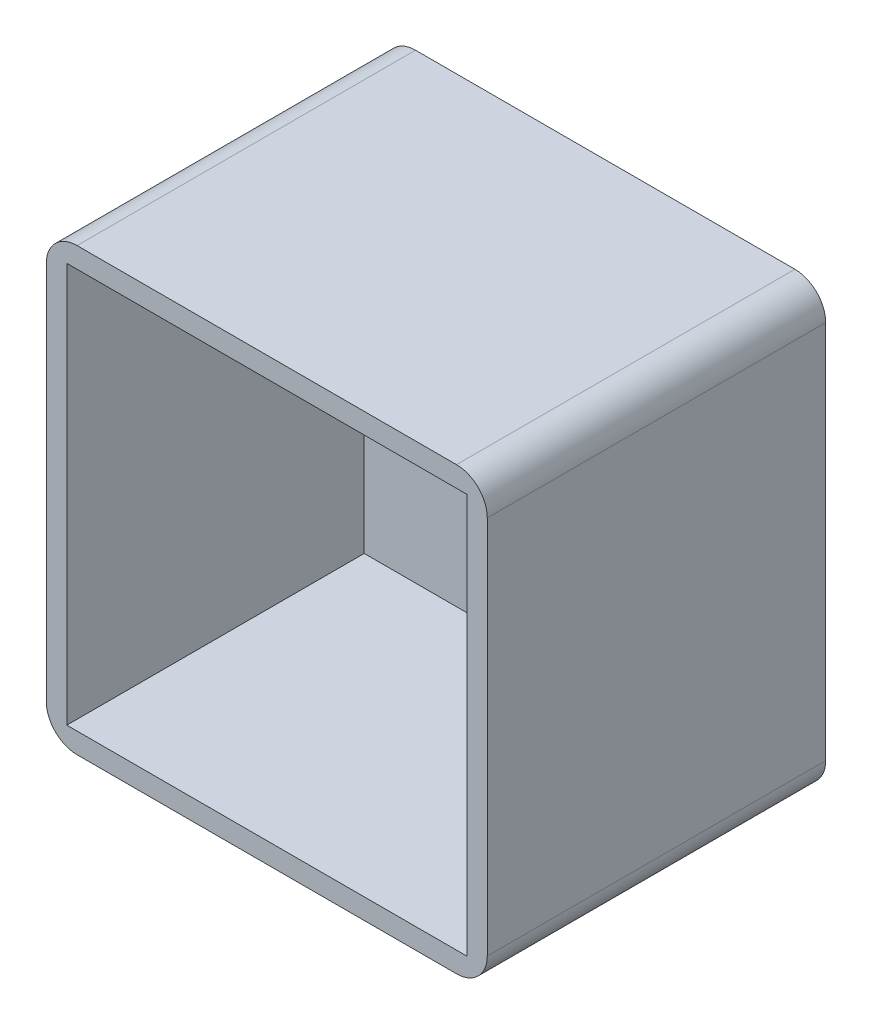
ISO-10303-21;
HEADER;
FILE_DESCRIPTION(('STEP AP214'),'2;1');
FILE_NAME('part.step','',(''),(''),'','','');
FILE_SCHEMA(('AUTOMOTIVE_DESIGN { 1 0 10303 214 1 1 1 1 }'));
ENDSEC;
DATA;
#1=APPLICATION_CONTEXT('core data for automotive mechanical design processes');
#2=APPLICATION_PROTOCOL_DEFINITION('international standard','automotive_design',2000,#1);
#3=PRODUCT_CONTEXT('',#1,'mechanical');
#4=PRODUCT('Part','Part','',(#3));
#5=PRODUCT_RELATED_PRODUCT_CATEGORY('part','',(#4));
#6=PRODUCT_DEFINITION_FORMATION('','',#4);
#7=PRODUCT_DEFINITION_CONTEXT('part definition',#1,'design');
#8=PRODUCT_DEFINITION('design','',#6,#7);
#9=PRODUCT_DEFINITION_SHAPE('','',#8);
#10=(LENGTH_UNIT() NAMED_UNIT(*) SI_UNIT(.MILLI.,.METRE.));
#11=(NAMED_UNIT(*) PLANE_ANGLE_UNIT() SI_UNIT($,.RADIAN.));
#12=(NAMED_UNIT(*) SI_UNIT($,.STERADIAN.) SOLID_ANGLE_UNIT());
#13=UNCERTAINTY_MEASURE_WITH_UNIT(LENGTH_MEASURE(1.E-05),#10,'distance_accuracy_value','');
#14=(GEOMETRIC_REPRESENTATION_CONTEXT(3) GLOBAL_UNCERTAINTY_ASSIGNED_CONTEXT((#13)) GLOBAL_UNIT_ASSIGNED_CONTEXT((#10,
#11,#12)) REPRESENTATION_CONTEXT('',''));
#15=CARTESIAN_POINT('',(0.,0.,0.));
#16=DIRECTION('',(0.,0.,1.));
#17=DIRECTION('',(1.,0.,0.));
#18=AXIS2_PLACEMENT_3D('',#15,#16,#17);
#19=CARTESIAN_POINT('',(-10.8125564669842,0.,12.));
#20=DIRECTION('',(1.,0.,0.));
#21=DIRECTION('',(0.,0.,-1.));
#22=AXIS2_PLACEMENT_3D('',#19,#20,#21);
#23=PLANE('',#22);
#24=DIRECTION('',(0.,0.,-1.));
#25=VECTOR('',#24,1.);
#26=CARTESIAN_POINT('',(-10.8125564669842,-23.2158524057952,0.));
#27=LINE('',#26,#25);
#28=CARTESIAN_POINT('',(-10.8125564669842,-23.2158524057952,12.));
#29=VERTEX_POINT('',#28);
#30=CARTESIAN_POINT('',(-10.8125564669842,-23.2158524057952,7.));
#31=VERTEX_POINT('',#30);
#32=EDGE_CURVE('E260',#29,#31,#27,.T.);
#33=ORIENTED_EDGE('',*,*,#32,.T.);
#34=DIRECTION('',(0.,1.,0.));
#35=VECTOR('',#34,1.);
#36=CARTESIAN_POINT('',(-10.8125564669842,0.,7.));
#37=LINE('',#36,#35);
#38=CARTESIAN_POINT('',(-10.8125564669842,-14.8158524057952,7.));
#39=VERTEX_POINT('',#38);
#40=EDGE_CURVE('E748',#31,#39,#37,.T.);
#41=ORIENTED_EDGE('',*,*,#40,.T.);
#42=DIRECTION('',(0.,0.,-1.));
#43=VECTOR('',#42,1.);
#44=CARTESIAN_POINT('',(-10.8125564669842,-14.8158524057952,12.));
#45=LINE('',#44,#43);
#46=CARTESIAN_POINT('',(-10.8125564669842,-14.8158524057952,12.));
#47=VERTEX_POINT('',#46);
#48=EDGE_CURVE('E258',#39,#47,#45,.F.);
#49=ORIENTED_EDGE('',*,*,#48,.T.);
#50=DIRECTION('',(0.,-1.,0.));
#51=VECTOR('',#50,1.);
#52=CARTESIAN_POINT('',(-10.8125564669842,0.,12.));
#53=LINE('',#52,#51);
#54=EDGE_CURVE('E410',#47,#29,#53,.T.);
#55=ORIENTED_EDGE('',*,*,#54,.T.);
#56=EDGE_LOOP('',(#33,#41,#49,#55));
#57=FACE_BOUND('',#56,.T.);
#58=ADVANCED_FACE('F39',(#57),#23,.T.);
#59=CARTESIAN_POINT('',(0.,-28.2158524057952,12.));
#60=DIRECTION('',(0.,1.,0.));
#61=DIRECTION('',(0.,0.,1.));
#62=AXIS2_PLACEMENT_3D('',#59,#60,#61);
#63=PLANE('',#62);
#64=DIRECTION('',(-1.,0.,0.));
#65=VECTOR('',#64,1.);
#66=CARTESIAN_POINT('',(0.,-28.2158524057952,7.));
#67=LINE('',#66,#65);
#68=CARTESIAN_POINT('',(-15.8125564669842,-28.2158524057952,7.));
#69=VERTEX_POINT('',#68);
#70=CARTESIAN_POINT('',(-24.2125564669842,-28.2158524057952,7.));
#71=VERTEX_POINT('',#70);
#72=EDGE_CURVE('E53',#69,#71,#67,.T.);
#73=ORIENTED_EDGE('',*,*,#72,.F.);
#74=DIRECTION('',(0.,0.,-1.));
#75=VECTOR('',#74,1.);
#76=CARTESIAN_POINT('',(-15.8125564669842,-28.2158524057952,12.));
#77=LINE('',#76,#75);
#78=CARTESIAN_POINT('',(-15.8125564669842,-28.2158524057952,12.));
#79=VERTEX_POINT('',#78);
#80=EDGE_CURVE('E264',#69,#79,#77,.F.);
#81=ORIENTED_EDGE('',*,*,#80,.T.);
#82=DIRECTION('',(1.,0.,0.));
#83=VECTOR('',#82,1.);
#84=CARTESIAN_POINT('',(0.,-28.2158524057952,12.));
#85=LINE('',#84,#83);
#86=CARTESIAN_POINT('',(-24.2125564669842,-28.2158524057952,12.));
#87=VERTEX_POINT('',#86);
#88=EDGE_CURVE('E316',#87,#79,#85,.T.);
#89=ORIENTED_EDGE('',*,*,#88,.F.);
#90=DIRECTION('',(0.,0.,-1.));
#91=VECTOR('',#90,1.);
#92=CARTESIAN_POINT('',(-24.2125564669842,-28.2158524057952,12.));
#93=LINE('',#92,#91);
#94=EDGE_CURVE('E265',#87,#71,#93,.T.);
#95=ORIENTED_EDGE('',*,*,#94,.T.);
#96=EDGE_LOOP('',(#73,#81,#89,#95));
#97=FACE_BOUND('',#96,.T.);
#98=ADVANCED_FACE('F518',(#97),#63,.F.);
#99=CARTESIAN_POINT('',(-29.2125564669842,0.,12.));
#100=DIRECTION('',(1.,0.,0.));
#101=DIRECTION('',(0.,0.,-1.));
#102=AXIS2_PLACEMENT_3D('',#99,#100,#101);
#103=PLANE('',#102);
#104=DIRECTION('',(0.,1.,0.));
#105=VECTOR('',#104,1.);
#106=CARTESIAN_POINT('',(-29.2125564669842,0.,7.));
#107=LINE('',#106,#105);
#108=CARTESIAN_POINT('',(-29.2125564669842,-23.2158524057952,7.));
#109=VERTEX_POINT('',#108);
#110=CARTESIAN_POINT('',(-29.2125564669842,-14.8158524057952,7.));
#111=VERTEX_POINT('',#110);
#112=EDGE_CURVE('E223',#109,#111,#107,.T.);
#113=ORIENTED_EDGE('',*,*,#112,.F.);
#114=DIRECTION('',(0.,0.,-1.));
#115=VECTOR('',#114,1.);
#116=CARTESIAN_POINT('',(-29.2125564669842,-23.2158524057952,12.));
#117=LINE('',#116,#115);
#118=CARTESIAN_POINT('',(-29.2125564669842,-23.2158524057952,12.));
#119=VERTEX_POINT('',#118);
#120=EDGE_CURVE('E232',#109,#119,#117,.F.);
#121=ORIENTED_EDGE('',*,*,#120,.T.);
#122=DIRECTION('',(0.,-1.,0.));
#123=VECTOR('',#122,1.);
#124=CARTESIAN_POINT('',(-29.2125564669842,0.,12.));
#125=LINE('',#124,#123);
#126=CARTESIAN_POINT('',(-29.2125564669842,-14.8158524057952,12.));
#127=VERTEX_POINT('',#126);
#128=EDGE_CURVE('E321',#127,#119,#125,.T.);
#129=ORIENTED_EDGE('',*,*,#128,.F.);
#130=DIRECTION('',(0.,0.,-1.));
#131=VECTOR('',#130,1.);
#132=CARTESIAN_POINT('',(-29.2125564669842,-14.8158524057952,0.));
#133=LINE('',#132,#131);
#134=EDGE_CURVE('E238',#127,#111,#133,.T.);
#135=ORIENTED_EDGE('',*,*,#134,.T.);
#136=EDGE_LOOP('',(#113,#121,#129,#135));
#137=FACE_BOUND('',#136,.T.);
#138=ADVANCED_FACE('F231',(#137),#103,.F.);
#139=CARTESIAN_POINT('',(0.,-9.81585240579516,12.));
#140=DIRECTION('',(0.,1.,0.));
#141=DIRECTION('',(0.,0.,1.));
#142=AXIS2_PLACEMENT_3D('',#139,#140,#141);
#143=PLANE('',#142);
#144=DIRECTION('',(0.,0.,-1.));
#145=VECTOR('',#144,1.);
#146=CARTESIAN_POINT('',(-15.8125564669842,-9.81585240579516,12.));
#147=LINE('',#146,#145);
#148=CARTESIAN_POINT('',(-15.8125564669842,-9.81585240579516,12.));
#149=VERTEX_POINT('',#148);
#150=CARTESIAN_POINT('',(-15.8125564669842,-9.81585240579516,7.));
#151=VERTEX_POINT('',#150);
#152=EDGE_CURVE('E244',#149,#151,#147,.T.);
#153=ORIENTED_EDGE('',*,*,#152,.T.);
#154=DIRECTION('',(-1.,0.,0.));
#155=VECTOR('',#154,1.);
#156=CARTESIAN_POINT('',(0.,-9.81585240579516,7.));
#157=LINE('',#156,#155);
#158=CARTESIAN_POINT('',(-24.2125564669842,-9.81585240579516,7.));
#159=VERTEX_POINT('',#158);
#160=EDGE_CURVE('E738',#151,#159,#157,.T.);
#161=ORIENTED_EDGE('',*,*,#160,.T.);
#162=DIRECTION('',(0.,0.,-1.));
#163=VECTOR('',#162,1.);
#164=CARTESIAN_POINT('',(-24.2125564669842,-9.81585240579516,12.));
#165=LINE('',#164,#163);
#166=CARTESIAN_POINT('',(-24.2125564669842,-9.81585240579516,12.));
#167=VERTEX_POINT('',#166);
#168=EDGE_CURVE('E253',#159,#167,#165,.F.);
#169=ORIENTED_EDGE('',*,*,#168,.T.);
#170=DIRECTION('',(1.,0.,0.));
#171=VECTOR('',#170,1.);
#172=CARTESIAN_POINT('',(0.,-9.81585240579516,12.));
#173=LINE('',#172,#171);
#174=EDGE_CURVE('E742',#167,#149,#173,.T.);
#175=ORIENTED_EDGE('',*,*,#174,.T.);
#176=EDGE_LOOP('',(#153,#161,#169,#175));
#177=FACE_BOUND('',#176,.T.);
#178=ADVANCED_FACE('F532',(#177),#143,.T.);
#179=CARTESIAN_POINT('',(-24.2125564669842,-14.8158524057952,12.));
#180=DIRECTION('',(0.,0.,1.));
#181=DIRECTION('',(1.,0.,0.));
#182=AXIS2_PLACEMENT_3D('',#179,#180,#181);
#183=CYLINDRICAL_SURFACE('',#182,5.);
#184=ORIENTED_EDGE('',*,*,#168,.F.);
#185=CARTESIAN_POINT('',(-24.2125564669842,-14.8158524057952,7.));
#186=DIRECTION('',(0.,0.,-1.));
#187=DIRECTION('',(-1.,0.,0.));
#188=AXIS2_PLACEMENT_3D('',#185,#186,#187);
#189=CIRCLE('',#188,5.);
#190=EDGE_CURVE('E760',#159,#111,#189,.F.);
#191=ORIENTED_EDGE('',*,*,#190,.T.);
#192=ORIENTED_EDGE('',*,*,#134,.F.);
#193=CARTESIAN_POINT('',(-24.2125564669842,-14.8158524057952,12.));
#194=DIRECTION('',(0.,0.,-1.));
#195=DIRECTION('',(-1.,0.,0.));
#196=AXIS2_PLACEMENT_3D('',#193,#194,#195);
#197=CIRCLE('',#196,5.);
#198=EDGE_CURVE('E267',#167,#127,#197,.F.);
#199=ORIENTED_EDGE('',*,*,#198,.F.);
#200=EDGE_LOOP('',(#184,#191,#192,#199));
#201=FACE_BOUND('',#200,.T.);
#202=ADVANCED_FACE('F690',(#201),#183,.T.);
#203=CARTESIAN_POINT('',(-15.8125564669842,-14.8158524057952,12.));
#204=DIRECTION('',(0.,0.,-1.));
#205=DIRECTION('',(-1.,0.,0.));
#206=AXIS2_PLACEMENT_3D('',#203,#204,#205);
#207=CYLINDRICAL_SURFACE('',#206,5.);
#208=ORIENTED_EDGE('',*,*,#48,.F.);
#209=CARTESIAN_POINT('',(-15.8125564669842,-14.8158524057952,7.));
#210=DIRECTION('',(0.,0.,-1.));
#211=DIRECTION('',(-1.,0.,0.));
#212=AXIS2_PLACEMENT_3D('',#209,#210,#211);
#213=CIRCLE('',#212,5.);
#214=EDGE_CURVE('E409',#39,#151,#213,.F.);
#215=ORIENTED_EDGE('',*,*,#214,.T.);
#216=ORIENTED_EDGE('',*,*,#152,.F.);
#217=CARTESIAN_POINT('',(-15.8125564669842,-14.8158524057952,12.));
#218=DIRECTION('',(0.,0.,-1.));
#219=DIRECTION('',(-1.,0.,0.));
#220=AXIS2_PLACEMENT_3D('',#217,#218,#219);
#221=CIRCLE('',#220,5.);
#222=EDGE_CURVE('E270',#47,#149,#221,.F.);
#223=ORIENTED_EDGE('',*,*,#222,.F.);
#224=EDGE_LOOP('',(#208,#215,#216,#223));
#225=FACE_BOUND('',#224,.T.);
#226=ADVANCED_FACE('F680',(#225),#207,.T.);
#227=CARTESIAN_POINT('',(-15.8125564669842,-23.2158524057952,12.));
#228=DIRECTION('',(0.,0.,1.));
#229=DIRECTION('',(1.,0.,0.));
#230=AXIS2_PLACEMENT_3D('',#227,#228,#229);
#231=CYLINDRICAL_SURFACE('',#230,5.);
#232=ORIENTED_EDGE('',*,*,#80,.F.);
#233=CARTESIAN_POINT('',(-15.8125564669842,-23.2158524057952,7.));
#234=DIRECTION('',(0.,0.,-1.));
#235=DIRECTION('',(-1.,0.,0.));
#236=AXIS2_PLACEMENT_3D('',#233,#234,#235);
#237=CIRCLE('',#236,5.);
#238=EDGE_CURVE('E758',#69,#31,#237,.F.);
#239=ORIENTED_EDGE('',*,*,#238,.T.);
#240=ORIENTED_EDGE('',*,*,#32,.F.);
#241=CARTESIAN_POINT('',(-15.8125564669842,-23.2158524057952,12.));
#242=DIRECTION('',(0.,0.,-1.));
#243=DIRECTION('',(-1.,0.,0.));
#244=AXIS2_PLACEMENT_3D('',#241,#242,#243);
#245=CIRCLE('',#244,5.);
#246=EDGE_CURVE('E268',#79,#29,#245,.F.);
#247=ORIENTED_EDGE('',*,*,#246,.F.);
#248=EDGE_LOOP('',(#232,#239,#240,#247));
#249=FACE_BOUND('',#248,.T.);
#250=ADVANCED_FACE('F668',(#249),#231,.T.);
#251=CARTESIAN_POINT('',(-24.2125564669842,-23.2158524057952,12.));
#252=DIRECTION('',(0.,0.,-1.));
#253=DIRECTION('',(-1.,0.,0.));
#254=AXIS2_PLACEMENT_3D('',#251,#252,#253);
#255=CYLINDRICAL_SURFACE('',#254,5.);
#256=ORIENTED_EDGE('',*,*,#120,.F.);
#257=CARTESIAN_POINT('',(-24.2125564669842,-23.2158524057952,7.));
#258=DIRECTION('',(0.,0.,-1.));
#259=DIRECTION('',(-1.,0.,0.));
#260=AXIS2_PLACEMENT_3D('',#257,#258,#259);
#261=CIRCLE('',#260,5.);
#262=EDGE_CURVE('E11',#109,#71,#261,.F.);
#263=ORIENTED_EDGE('',*,*,#262,.T.);
#264=ORIENTED_EDGE('',*,*,#94,.F.);
#265=CARTESIAN_POINT('',(-24.2125564669842,-23.2158524057952,12.));
#266=DIRECTION('',(0.,0.,-1.));
#267=DIRECTION('',(-1.,0.,0.));
#268=AXIS2_PLACEMENT_3D('',#265,#266,#267);
#269=CIRCLE('',#268,5.);
#270=EDGE_CURVE('E245',#119,#87,#269,.F.);
#271=ORIENTED_EDGE('',*,*,#270,.F.);
#272=EDGE_LOOP('',(#256,#263,#264,#271));
#273=FACE_BOUND('',#272,.T.);
#274=ADVANCED_FACE('F241',(#273),#255,.T.);
#275=CARTESIAN_POINT('',(-41.,-41.,45.));
#276=DIRECTION('',(0.,1.,0.));
#277=DIRECTION('',(-1.,0.,0.));
#278=AXIS2_PLACEMENT_3D('',#275,#276,#277);
#279=PLANE('',#278);
#280=DIRECTION('',(1.,0.,0.));
#281=VECTOR('',#280,1.);
#282=CARTESIAN_POINT('',(-41.,-41.,45.));
#283=LINE('',#282,#281);
#284=CARTESIAN_POINT('',(-38.,-41.,45.));
#285=VERTEX_POINT('',#284);
#286=CARTESIAN_POINT('',(-0.999999999999987,-41.,45.));
#287=VERTEX_POINT('',#286);
#288=EDGE_CURVE('E243',#285,#287,#283,.T.);
#289=ORIENTED_EDGE('',*,*,#288,.F.);
#290=DIRECTION('',(0.,0.,-1.));
#291=VECTOR('',#290,1.);
#292=CARTESIAN_POINT('',(-38.,-41.,12.));
#293=LINE('',#292,#291);
#294=CARTESIAN_POINT('',(-38.,-41.,12.));
#295=VERTEX_POINT('',#294);
#296=EDGE_CURVE('E50',#285,#295,#293,.T.);
#297=ORIENTED_EDGE('',*,*,#296,.T.);
#298=DIRECTION('',(-1.,0.,0.));
#299=VECTOR('',#298,1.);
#300=CARTESIAN_POINT('',(0.,-41.,12.));
#301=LINE('',#300,#299);
#302=CARTESIAN_POINT('',(-0.999999999999989,-41.,12.));
#303=VERTEX_POINT('',#302);
#304=EDGE_CURVE('E308',#303,#295,#301,.T.);
#305=ORIENTED_EDGE('',*,*,#304,.F.);
#306=DIRECTION('',(0.,0.,-1.));
#307=VECTOR('',#306,1.);
#308=CARTESIAN_POINT('',(-0.999999999999987,-41.,45.));
#309=LINE('',#308,#307);
#310=EDGE_CURVE('E62',#303,#287,#309,.F.);
#311=ORIENTED_EDGE('',*,*,#310,.T.);
#312=EDGE_LOOP('',(#289,#297,#305,#311));
#313=FACE_BOUND('',#312,.T.);
#314=ADVANCED_FACE('F310',(#313),#279,.F.);
#315=CARTESIAN_POINT('',(2.00000000000001,-41.,45.));
#316=DIRECTION('',(-1.,0.,0.));
#317=DIRECTION('',(0.,0.,1.));
#318=AXIS2_PLACEMENT_3D('',#315,#316,#317);
#319=PLANE('',#318);
#320=DIRECTION('',(0.,-1.,0.));
#321=VECTOR('',#320,1.);
#322=CARTESIAN_POINT('',(2.00000000000001,0.,12.));
#323=LINE('',#322,#321);
#324=CARTESIAN_POINT('',(2.00000000000001,-0.999999999999991,12.));
#325=VERTEX_POINT('',#324);
#326=CARTESIAN_POINT('',(2.00000000000001,-38.,12.));
#327=VERTEX_POINT('',#326);
#328=EDGE_CURVE('E329',#325,#327,#323,.T.);
#329=ORIENTED_EDGE('',*,*,#328,.F.);
#330=DIRECTION('',(0.,0.,-1.));
#331=VECTOR('',#330,1.);
#332=CARTESIAN_POINT('',(2.00000000000001,-0.999999999999991,45.));
#333=LINE('',#332,#331);
#334=CARTESIAN_POINT('',(2.00000000000001,-0.999999999999994,45.));
#335=VERTEX_POINT('',#334);
#336=EDGE_CURVE('E286',#325,#335,#333,.F.);
#337=ORIENTED_EDGE('',*,*,#336,.T.);
#338=DIRECTION('',(0.,1.,0.));
#339=VECTOR('',#338,1.);
#340=CARTESIAN_POINT('',(2.00000000000001,-41.,45.));
#341=LINE('',#340,#339);
#342=CARTESIAN_POINT('',(2.00000000000001,-38.,45.));
#343=VERTEX_POINT('',#342);
#344=EDGE_CURVE('E250',#343,#335,#341,.T.);
#345=ORIENTED_EDGE('',*,*,#344,.F.);
#346=DIRECTION('',(0.,0.,-1.));
#347=VECTOR('',#346,1.);
#348=CARTESIAN_POINT('',(2.00000000000001,-38.,45.));
#349=LINE('',#348,#347);
#350=EDGE_CURVE('E287',#343,#327,#349,.T.);
#351=ORIENTED_EDGE('',*,*,#350,.T.);
#352=EDGE_LOOP('',(#329,#337,#345,#351));
#353=FACE_BOUND('',#352,.T.);
#354=ADVANCED_FACE('F552',(#353),#319,.F.);
#355=CARTESIAN_POINT('',(-36.,-13.,7.));
#356=DIRECTION('',(0.,0.,1.));
#357=DIRECTION('',(1.,0.,0.));
#358=AXIS2_PLACEMENT_3D('',#355,#356,#357);
#359=CYLINDRICAL_SURFACE('',#358,3.);
#360=CARTESIAN_POINT('',(-36.,-13.,12.));
#361=DIRECTION('',(0.,0.,-1.));
#362=DIRECTION('',(-1.,0.,0.));
#363=AXIS2_PLACEMENT_3D('',#360,#361,#362);
#364=CIRCLE('',#363,3.);
#365=CARTESIAN_POINT('',(-33.,-13.,12.));
#366=VERTEX_POINT('',#365);
#367=CARTESIAN_POINT('',(-39.,-13.,12.));
#368=VERTEX_POINT('',#367);
#369=EDGE_CURVE('E350',#366,#368,#364,.F.);
#370=ORIENTED_EDGE('',*,*,#369,.F.);
#371=DIRECTION('',(0.,0.,1.));
#372=VECTOR('',#371,1.);
#373=CARTESIAN_POINT('',(-33.,-13.,7.));
#374=LINE('',#373,#372);
#375=CARTESIAN_POINT('',(-33.,-13.,16.));
#376=VERTEX_POINT('',#375);
#377=EDGE_CURVE('E401',#366,#376,#374,.T.);
#378=ORIENTED_EDGE('',*,*,#377,.T.);
#379=CARTESIAN_POINT('',(-36.,-13.,16.));
#380=DIRECTION('',(0.,0.,1.));
#381=DIRECTION('',(1.,0.,0.));
#382=AXIS2_PLACEMENT_3D('',#379,#380,#381);
#383=CIRCLE('',#382,3.);
#384=CARTESIAN_POINT('',(-39.,-13.,16.));
#385=VERTEX_POINT('',#384);
#386=EDGE_CURVE('E398',#385,#376,#383,.F.);
#387=ORIENTED_EDGE('',*,*,#386,.F.);
#388=DIRECTION('',(0.,0.,1.));
#389=VECTOR('',#388,1.);
#390=CARTESIAN_POINT('',(-39.,-13.,7.));
#391=LINE('',#390,#389);
#392=EDGE_CURVE('E423',#368,#385,#391,.T.);
#393=ORIENTED_EDGE('',*,*,#392,.F.);
#394=EDGE_LOOP('',(#370,#378,#387,#393));
#395=FACE_BOUND('',#394,.T.);
#396=ADVANCED_FACE('F470',(#395),#359,.F.);
#397=CARTESIAN_POINT('',(-33.,-13.,7.));
#398=DIRECTION('',(-1.,0.,0.));
#399=DIRECTION('',(0.,-1.,0.));
#400=AXIS2_PLACEMENT_3D('',#397,#398,#399);
#401=PLANE('',#400);
#402=ORIENTED_EDGE('',*,*,#377,.F.);
#403=DIRECTION('',(0.,-1.,0.));
#404=VECTOR('',#403,1.);
#405=CARTESIAN_POINT('',(-33.,-13.,12.));
#406=LINE('',#405,#404);
#407=CARTESIAN_POINT('',(-33.,-25.,12.));
#408=VERTEX_POINT('',#407);
#409=EDGE_CURVE('E341',#366,#408,#406,.T.);
#410=ORIENTED_EDGE('',*,*,#409,.T.);
#411=DIRECTION('',(0.,0.,1.));
#412=VECTOR('',#411,1.);
#413=CARTESIAN_POINT('',(-33.,-25.,7.));
#414=LINE('',#413,#412);
#415=CARTESIAN_POINT('',(-33.,-25.,16.));
#416=VERTEX_POINT('',#415);
#417=EDGE_CURVE('E424',#408,#416,#414,.T.);
#418=ORIENTED_EDGE('',*,*,#417,.T.);
#419=DIRECTION('',(0.,1.,0.));
#420=VECTOR('',#419,1.);
#421=CARTESIAN_POINT('',(-33.,-13.,16.));
#422=LINE('',#421,#420);
#423=EDGE_CURVE('E399',#416,#376,#422,.T.);
#424=ORIENTED_EDGE('',*,*,#423,.T.);
#425=EDGE_LOOP('',(#402,#410,#418,#424));
#426=FACE_BOUND('',#425,.T.);
#427=ADVANCED_FACE('F475',(#426),#401,.T.);
#428=CARTESIAN_POINT('',(-36.,-25.,7.));
#429=DIRECTION('',(0.,0.,1.));
#430=DIRECTION('',(1.,0.,0.));
#431=AXIS2_PLACEMENT_3D('',#428,#429,#430);
#432=CYLINDRICAL_SURFACE('',#431,3.);
#433=CARTESIAN_POINT('',(-36.,-25.,12.));
#434=DIRECTION('',(0.,0.,-1.));
#435=DIRECTION('',(-1.,0.,0.));
#436=AXIS2_PLACEMENT_3D('',#433,#434,#435);
#437=CIRCLE('',#436,3.);
#438=CARTESIAN_POINT('',(-39.,-25.,12.));
#439=VERTEX_POINT('',#438);
#440=EDGE_CURVE('E345',#439,#408,#437,.F.);
#441=ORIENTED_EDGE('',*,*,#440,.F.);
#442=DIRECTION('',(0.,0.,1.));
#443=VECTOR('',#442,1.);
#444=CARTESIAN_POINT('',(-39.,-25.,7.));
#445=LINE('',#444,#443);
#446=CARTESIAN_POINT('',(-39.,-25.,16.));
#447=VERTEX_POINT('',#446);
#448=EDGE_CURVE('E421',#439,#447,#445,.T.);
#449=ORIENTED_EDGE('',*,*,#448,.T.);
#450=CARTESIAN_POINT('',(-36.,-25.,16.));
#451=DIRECTION('',(0.,0.,1.));
#452=DIRECTION('',(1.,0.,0.));
#453=AXIS2_PLACEMENT_3D('',#450,#451,#452);
#454=CIRCLE('',#453,3.);
#455=EDGE_CURVE('E394',#416,#447,#454,.F.);
#456=ORIENTED_EDGE('',*,*,#455,.F.);
#457=ORIENTED_EDGE('',*,*,#417,.F.);
#458=EDGE_LOOP('',(#441,#449,#456,#457));
#459=FACE_BOUND('',#458,.T.);
#460=ADVANCED_FACE('F473',(#459),#432,.F.);
#461=CARTESIAN_POINT('',(-6.,0.,7.));
#462=DIRECTION('',(-1.,0.,0.));
#463=DIRECTION('',(0.,-1.,0.));
#464=AXIS2_PLACEMENT_3D('',#461,#462,#463);
#465=PLANE('',#464);
#466=DIRECTION('',(0.,-1.,0.));
#467=VECTOR('',#466,1.);
#468=CARTESIAN_POINT('',(-6.,0.,12.));
#469=LINE('',#468,#467);
#470=CARTESIAN_POINT('',(-6.,-13.,12.));
#471=VERTEX_POINT('',#470);
#472=CARTESIAN_POINT('',(-5.99999999999999,-25.,12.));
#473=VERTEX_POINT('',#472);
#474=EDGE_CURVE('E336',#471,#473,#469,.T.);
#475=ORIENTED_EDGE('',*,*,#474,.F.);
#476=DIRECTION('',(0.,0.,1.));
#477=VECTOR('',#476,1.);
#478=CARTESIAN_POINT('',(-6.,-13.,7.));
#479=LINE('',#478,#477);
#480=CARTESIAN_POINT('',(-6.,-13.,16.));
#481=VERTEX_POINT('',#480);
#482=EDGE_CURVE('E417',#471,#481,#479,.T.);
#483=ORIENTED_EDGE('',*,*,#482,.T.);
#484=DIRECTION('',(0.,1.,0.));
#485=VECTOR('',#484,1.);
#486=CARTESIAN_POINT('',(-6.,0.,16.));
#487=LINE('',#486,#485);
#488=CARTESIAN_POINT('',(-5.99999999999999,-25.,16.));
#489=VERTEX_POINT('',#488);
#490=EDGE_CURVE('E389',#489,#481,#487,.T.);
#491=ORIENTED_EDGE('',*,*,#490,.F.);
#492=DIRECTION('',(0.,0.,1.));
#493=VECTOR('',#492,1.);
#494=CARTESIAN_POINT('',(-5.99999999999999,-25.,7.));
#495=LINE('',#494,#493);
#496=EDGE_CURVE('E406',#473,#489,#495,.T.);
#497=ORIENTED_EDGE('',*,*,#496,.F.);
#498=EDGE_LOOP('',(#475,#483,#491,#497));
#499=FACE_BOUND('',#498,.T.);
#500=ADVANCED_FACE('F495',(#499),#465,.F.);
#501=CARTESIAN_POINT('',(-3.,-13.,7.));
#502=DIRECTION('',(0.,0.,1.));
#503=DIRECTION('',(1.,0.,0.));
#504=AXIS2_PLACEMENT_3D('',#501,#502,#503);
#505=CYLINDRICAL_SURFACE('',#504,3.);
#506=CARTESIAN_POINT('',(-3.,-13.,12.));
#507=DIRECTION('',(0.,0.,-1.));
#508=DIRECTION('',(-1.,0.,0.));
#509=AXIS2_PLACEMENT_3D('',#506,#507,#508);
#510=CIRCLE('',#509,3.);
#511=CARTESIAN_POINT('',(0.,-13.,12.));
#512=VERTEX_POINT('',#511);
#513=EDGE_CURVE('E337',#512,#471,#510,.F.);
#514=ORIENTED_EDGE('',*,*,#513,.F.);
#515=DIRECTION('',(0.,0.,1.));
#516=VECTOR('',#515,1.);
#517=CARTESIAN_POINT('',(0.,-13.,7.));
#518=LINE('',#517,#516);
#519=CARTESIAN_POINT('',(0.,-13.,16.));
#520=VERTEX_POINT('',#519);
#521=EDGE_CURVE('E414',#512,#520,#518,.T.);
#522=ORIENTED_EDGE('',*,*,#521,.T.);
#523=CARTESIAN_POINT('',(-3.,-13.,16.));
#524=DIRECTION('',(0.,0.,1.));
#525=DIRECTION('',(1.,0.,0.));
#526=AXIS2_PLACEMENT_3D('',#523,#524,#525);
#527=CIRCLE('',#526,3.);
#528=EDGE_CURVE('E392',#481,#520,#527,.F.);
#529=ORIENTED_EDGE('',*,*,#528,.F.);
#530=ORIENTED_EDGE('',*,*,#482,.F.);
#531=EDGE_LOOP('',(#514,#522,#529,#530));
#532=FACE_BOUND('',#531,.T.);
#533=ADVANCED_FACE('F498',(#532),#505,.F.);
#534=CARTESIAN_POINT('',(-3.,-25.,7.));
#535=DIRECTION('',(0.,0.,1.));
#536=DIRECTION('',(1.,0.,0.));
#537=AXIS2_PLACEMENT_3D('',#534,#535,#536);
#538=CYLINDRICAL_SURFACE('',#537,3.);
#539=CARTESIAN_POINT('',(-3.,-25.,12.));
#540=DIRECTION('',(0.,0.,-1.));
#541=DIRECTION('',(-1.,0.,0.));
#542=AXIS2_PLACEMENT_3D('',#539,#540,#541);
#543=CIRCLE('',#542,3.);
#544=CARTESIAN_POINT('',(0.,-25.,12.));
#545=VERTEX_POINT('',#544);
#546=EDGE_CURVE('E331',#473,#545,#543,.F.);
#547=ORIENTED_EDGE('',*,*,#546,.F.);
#548=ORIENTED_EDGE('',*,*,#496,.T.);
#549=CARTESIAN_POINT('',(-3.,-25.,16.));
#550=DIRECTION('',(0.,0.,1.));
#551=DIRECTION('',(1.,0.,0.));
#552=AXIS2_PLACEMENT_3D('',#549,#550,#551);
#553=CIRCLE('',#552,3.);
#554=CARTESIAN_POINT('',(0.,-25.,16.));
#555=VERTEX_POINT('',#554);
#556=EDGE_CURVE('E383',#555,#489,#553,.F.);
#557=ORIENTED_EDGE('',*,*,#556,.F.);
#558=DIRECTION('',(0.,0.,1.));
#559=VECTOR('',#558,1.);
#560=CARTESIAN_POINT('',(0.,-25.,7.));
#561=LINE('',#560,#559);
#562=EDGE_CURVE('E415',#545,#555,#561,.T.);
#563=ORIENTED_EDGE('',*,*,#562,.F.);
#564=EDGE_LOOP('',(#547,#548,#557,#563));
#565=FACE_BOUND('',#564,.T.);
#566=ADVANCED_FACE('F486',(#565),#538,.F.);
#567=CARTESIAN_POINT('',(-39.,-13.,7.));
#568=DIRECTION('',(-1.,0.,0.));
#569=DIRECTION('',(0.,-1.,0.));
#570=AXIS2_PLACEMENT_3D('',#567,#568,#569);
#571=PLANE('',#570);
#572=DIRECTION('',(0.,-1.,0.));
#573=VECTOR('',#572,1.);
#574=CARTESIAN_POINT('',(-39.,-13.,12.));
#575=LINE('',#574,#573);
#576=EDGE_CURVE('E338',#368,#439,#575,.T.);
#577=ORIENTED_EDGE('',*,*,#576,.F.);
#578=ORIENTED_EDGE('',*,*,#392,.T.);
#579=DIRECTION('',(0.,-1.,0.));
#580=VECTOR('',#579,1.);
#581=CARTESIAN_POINT('',(-39.,0.,16.));
#582=LINE('',#581,#580);
#583=CARTESIAN_POINT('',(-39.,0.,16.));
#584=VERTEX_POINT('',#583);
#585=EDGE_CURVE('E356',#584,#385,#582,.T.);
#586=ORIENTED_EDGE('',*,*,#585,.F.);
#587=DIRECTION('',(0.,0.,1.));
#588=VECTOR('',#587,1.);
#589=CARTESIAN_POINT('',(-39.,0.,16.));
#590=LINE('',#589,#588);
#591=CARTESIAN_POINT('',(-39.,0.,45.));
#592=VERTEX_POINT('',#591);
#593=EDGE_CURVE('E380',#584,#592,#590,.T.);
#594=ORIENTED_EDGE('',*,*,#593,.T.);
#595=DIRECTION('',(0.,-1.,0.));
#596=VECTOR('',#595,1.);
#597=CARTESIAN_POINT('',(-39.,-13.,45.));
#598=LINE('',#597,#596);
#599=CARTESIAN_POINT('',(-39.,-39.,45.));
#600=VERTEX_POINT('',#599);
#601=EDGE_CURVE('E420',#592,#600,#598,.T.);
#602=ORIENTED_EDGE('',*,*,#601,.T.);
#603=DIRECTION('',(0.,0.,1.));
#604=VECTOR('',#603,1.);
#605=CARTESIAN_POINT('',(-39.,-39.,16.));
#606=LINE('',#605,#604);
#607=CARTESIAN_POINT('',(-39.,-39.,16.));
#608=VERTEX_POINT('',#607);
#609=EDGE_CURVE('E372',#608,#600,#606,.T.);
#610=ORIENTED_EDGE('',*,*,#609,.F.);
#611=EDGE_CURVE('E357',#447,#608,#582,.T.);
#612=ORIENTED_EDGE('',*,*,#611,.F.);
#613=ORIENTED_EDGE('',*,*,#448,.F.);
#614=EDGE_LOOP('',(#577,#578,#586,#594,#602,#610,#612,#613));
#615=FACE_BOUND('',#614,.T.);
#616=ADVANCED_FACE('F465',(#615),#571,.F.);
#617=CARTESIAN_POINT('',(0.,0.,7.));
#618=DIRECTION('',(-1.,0.,0.));
#619=DIRECTION('',(0.,0.,1.));
#620=AXIS2_PLACEMENT_3D('',#617,#618,#619);
#621=PLANE('',#620);
#622=ORIENTED_EDGE('',*,*,#521,.F.);
#623=DIRECTION('',(0.,-1.,0.));
#624=VECTOR('',#623,1.);
#625=CARTESIAN_POINT('',(0.,0.,12.));
#626=LINE('',#625,#624);
#627=EDGE_CURVE('E332',#512,#545,#626,.T.);
#628=ORIENTED_EDGE('',*,*,#627,.T.);
#629=ORIENTED_EDGE('',*,*,#562,.T.);
#630=DIRECTION('',(0.,1.,0.));
#631=VECTOR('',#630,1.);
#632=CARTESIAN_POINT('',(0.,-39.,16.));
#633=LINE('',#632,#631);
#634=CARTESIAN_POINT('',(0.,-39.,16.));
#635=VERTEX_POINT('',#634);
#636=EDGE_CURVE('E346',#635,#555,#633,.T.);
#637=ORIENTED_EDGE('',*,*,#636,.F.);
#638=DIRECTION('',(0.,0.,1.));
#639=VECTOR('',#638,1.);
#640=CARTESIAN_POINT('',(0.,-39.,16.));
#641=LINE('',#640,#639);
#642=CARTESIAN_POINT('',(0.,-39.,45.));
#643=VERTEX_POINT('',#642);
#644=EDGE_CURVE('E369',#635,#643,#641,.T.);
#645=ORIENTED_EDGE('',*,*,#644,.T.);
#646=DIRECTION('',(0.,-1.,0.));
#647=VECTOR('',#646,1.);
#648=CARTESIAN_POINT('',(0.,0.,45.));
#649=LINE('',#648,#647);
#650=CARTESIAN_POINT('',(0.,0.,45.));
#651=VERTEX_POINT('',#650);
#652=EDGE_CURVE('E412',#651,#643,#649,.T.);
#653=ORIENTED_EDGE('',*,*,#652,.F.);
#654=DIRECTION('',(0.,0.,1.));
#655=VECTOR('',#654,1.);
#656=CARTESIAN_POINT('',(0.,0.,16.));
#657=LINE('',#656,#655);
#658=CARTESIAN_POINT('',(0.,0.,16.));
#659=VERTEX_POINT('',#658);
#660=EDGE_CURVE('E364',#659,#651,#657,.T.);
#661=ORIENTED_EDGE('',*,*,#660,.F.);
#662=EDGE_CURVE('E351',#520,#659,#633,.T.);
#663=ORIENTED_EDGE('',*,*,#662,.F.);
#664=EDGE_LOOP('',(#622,#628,#629,#637,#645,#653,#661,#663));
#665=FACE_BOUND('',#664,.T.);
#666=ADVANCED_FACE('F444',(#665),#621,.T.);
#667=CARTESIAN_POINT('',(-20.,-3.50676126122746,7.));
#668=DIRECTION('',(0.,0.,1.));
#669=DIRECTION('',(1.,0.,0.));
#670=AXIS2_PLACEMENT_3D('',#667,#668,#669);
#671=CYLINDRICAL_SURFACE('',#670,3.);
#672=CARTESIAN_POINT('',(-20.,-3.50676126122746,16.));
#673=DIRECTION('',(0.,0.,1.));
#674=DIRECTION('',(1.,0.,0.));
#675=AXIS2_PLACEMENT_3D('',#672,#673,#674);
#676=CIRCLE('',#675,3.);
#677=CARTESIAN_POINT('',(-17.,-3.50676126122746,16.));
#678=VERTEX_POINT('',#677);
#679=EDGE_CURVE('E373',#678,#678,#676,.F.);
#680=ORIENTED_EDGE('',*,*,#679,.F.);
#681=EDGE_LOOP('',(#680));
#682=FACE_BOUND('',#681,.T.);
#683=CARTESIAN_POINT('',(-20.,-3.50676126122746,12.));
#684=DIRECTION('',(0.,0.,-1.));
#685=DIRECTION('',(-1.,0.,0.));
#686=AXIS2_PLACEMENT_3D('',#683,#684,#685);
#687=CIRCLE('',#686,3.);
#688=CARTESIAN_POINT('',(-23.,-3.50676126122746,12.));
#689=VERTEX_POINT('',#688);
#690=EDGE_CURVE('E249',#689,#689,#687,.F.);
#691=ORIENTED_EDGE('',*,*,#690,.F.);
#692=EDGE_LOOP('',(#691));
#693=FACE_BOUND('',#692,.T.);
#694=ADVANCED_FACE('F441',(#682,#693),#671,.F.);
#695=CARTESIAN_POINT('',(0.,0.,45.));
#696=DIRECTION('',(0.,0.,-1.));
#697=DIRECTION('',(-1.,0.,0.));
#698=AXIS2_PLACEMENT_3D('',#695,#696,#697);
#699=PLANE('',#698);
#700=ORIENTED_EDGE('',*,*,#344,.T.);
#701=CARTESIAN_POINT('',(-0.999999999999994,-0.999999999999991,45.));
#702=DIRECTION('',(0.,0.,-1.));
#703=DIRECTION('',(-1.,0.,0.));
#704=AXIS2_PLACEMENT_3D('',#701,#702,#703);
#705=CIRCLE('',#704,3.);
#706=CARTESIAN_POINT('',(-0.999999999999994,2.00000000000001,45.));
#707=VERTEX_POINT('',#706);
#708=EDGE_CURVE('E300',#335,#707,#705,.F.);
#709=ORIENTED_EDGE('',*,*,#708,.T.);
#710=DIRECTION('',(1.,0.,0.));
#711=VECTOR('',#710,1.);
#712=CARTESIAN_POINT('',(-41.,2.,45.));
#713=LINE('',#712,#711);
#714=CARTESIAN_POINT('',(-38.,2.,45.));
#715=VERTEX_POINT('',#714);
#716=EDGE_CURVE('E431',#715,#707,#713,.T.);
#717=ORIENTED_EDGE('',*,*,#716,.F.);
#718=CARTESIAN_POINT('',(-38.,-1.00000000000001,45.));
#719=DIRECTION('',(0.,0.,-1.));
#720=DIRECTION('',(-1.,0.,0.));
#721=AXIS2_PLACEMENT_3D('',#718,#719,#720);
#722=CIRCLE('',#721,3.);
#723=CARTESIAN_POINT('',(-41.,-1.00000000000001,45.));
#724=VERTEX_POINT('',#723);
#725=EDGE_CURVE('E294',#715,#724,#722,.F.);
#726=ORIENTED_EDGE('',*,*,#725,.T.);
#727=DIRECTION('',(0.,1.,0.));
#728=VECTOR('',#727,1.);
#729=CARTESIAN_POINT('',(-41.,-41.,45.));
#730=LINE('',#729,#728);
#731=CARTESIAN_POINT('',(-41.,-38.,45.));
#732=VERTEX_POINT('',#731);
#733=EDGE_CURVE('E418',#732,#724,#730,.T.);
#734=ORIENTED_EDGE('',*,*,#733,.F.);
#735=CARTESIAN_POINT('',(-38.,-38.,45.));
#736=DIRECTION('',(0.,0.,-1.));
#737=DIRECTION('',(-1.,0.,0.));
#738=AXIS2_PLACEMENT_3D('',#735,#736,#737);
#739=CIRCLE('',#738,3.);
#740=EDGE_CURVE('E291',#732,#285,#739,.F.);
#741=ORIENTED_EDGE('',*,*,#740,.T.);
#742=ORIENTED_EDGE('',*,*,#288,.T.);
#743=CARTESIAN_POINT('',(-0.99999999999999,-38.,45.));
#744=DIRECTION('',(0.,0.,-1.));
#745=DIRECTION('',(-1.,0.,0.));
#746=AXIS2_PLACEMENT_3D('',#743,#744,#745);
#747=CIRCLE('',#746,3.);
#748=EDGE_CURVE('E293',#287,#343,#747,.F.);
#749=ORIENTED_EDGE('',*,*,#748,.T.);
#750=EDGE_LOOP('',(#700,#709,#717,#726,#734,#741,#742,#749));
#751=FACE_BOUND('',#750,.T.);
#752=DIRECTION('',(-1.,0.,0.));
#753=VECTOR('',#752,1.);
#754=CARTESIAN_POINT('',(0.,0.,45.));
#755=LINE('',#754,#753);
#756=EDGE_CURVE('E349',#651,#592,#755,.T.);
#757=ORIENTED_EDGE('',*,*,#756,.F.);
#758=ORIENTED_EDGE('',*,*,#652,.T.);
#759=DIRECTION('',(1.,0.,0.));
#760=VECTOR('',#759,1.);
#761=CARTESIAN_POINT('',(-39.,-39.,45.));
#762=LINE('',#761,#760);
#763=EDGE_CURVE('E370',#600,#643,#762,.T.);
#764=ORIENTED_EDGE('',*,*,#763,.F.);
#765=ORIENTED_EDGE('',*,*,#601,.F.);
#766=EDGE_LOOP('',(#757,#758,#764,#765));
#767=FACE_BOUND('',#766,.T.);
#768=ADVANCED_FACE('F443',(#751,#767),#699,.F.);
#769=CARTESIAN_POINT('',(-41.,-41.,45.));
#770=DIRECTION('',(-1.,0.,0.));
#771=DIRECTION('',(0.,0.,1.));
#772=AXIS2_PLACEMENT_3D('',#769,#770,#771);
#773=PLANE('',#772);
#774=ORIENTED_EDGE('',*,*,#733,.T.);
#775=DIRECTION('',(0.,0.,-1.));
#776=VECTOR('',#775,1.);
#777=CARTESIAN_POINT('',(-41.,-1.00000000000001,45.));
#778=LINE('',#777,#776);
#779=CARTESIAN_POINT('',(-41.,-1.00000000000001,12.));
#780=VERTEX_POINT('',#779);
#781=EDGE_CURVE('E301',#724,#780,#778,.T.);
#782=ORIENTED_EDGE('',*,*,#781,.T.);
#783=DIRECTION('',(0.,1.,0.));
#784=VECTOR('',#783,1.);
#785=CARTESIAN_POINT('',(-41.,0.,12.));
#786=LINE('',#785,#784);
#787=CARTESIAN_POINT('',(-41.,-38.,12.));
#788=VERTEX_POINT('',#787);
#789=EDGE_CURVE('E319',#788,#780,#786,.T.);
#790=ORIENTED_EDGE('',*,*,#789,.F.);
#791=DIRECTION('',(0.,0.,-1.));
#792=VECTOR('',#791,1.);
#793=CARTESIAN_POINT('',(-41.,-38.,45.));
#794=LINE('',#793,#792);
#795=EDGE_CURVE('E299',#788,#732,#794,.F.);
#796=ORIENTED_EDGE('',*,*,#795,.T.);
#797=EDGE_LOOP('',(#774,#782,#790,#796));
#798=FACE_BOUND('',#797,.T.);
#799=ADVANCED_FACE('F510',(#798),#773,.T.);
#800=CARTESIAN_POINT('',(-41.,2.,45.));
#801=DIRECTION('',(0.,1.,0.));
#802=DIRECTION('',(-1.,0.,0.));
#803=AXIS2_PLACEMENT_3D('',#800,#801,#802);
#804=PLANE('',#803);
#805=ORIENTED_EDGE('',*,*,#716,.T.);
#806=DIRECTION('',(0.,0.,-1.));
#807=VECTOR('',#806,1.);
#808=CARTESIAN_POINT('',(-0.999999999999994,2.00000000000001,12.));
#809=LINE('',#808,#807);
#810=CARTESIAN_POINT('',(-0.999999999999994,2.00000000000001,12.));
#811=VERTEX_POINT('',#810);
#812=EDGE_CURVE('E273',#707,#811,#809,.T.);
#813=ORIENTED_EDGE('',*,*,#812,.T.);
#814=DIRECTION('',(1.,0.,0.));
#815=VECTOR('',#814,1.);
#816=CARTESIAN_POINT('',(0.,2.00000000000001,12.));
#817=LINE('',#816,#815);
#818=CARTESIAN_POINT('',(-38.,2.,12.));
#819=VERTEX_POINT('',#818);
#820=EDGE_CURVE('E322',#819,#811,#817,.T.);
#821=ORIENTED_EDGE('',*,*,#820,.F.);
#822=DIRECTION('',(0.,0.,-1.));
#823=VECTOR('',#822,1.);
#824=CARTESIAN_POINT('',(-38.,2.,45.));
#825=LINE('',#824,#823);
#826=EDGE_CURVE('E271',#819,#715,#825,.F.);
#827=ORIENTED_EDGE('',*,*,#826,.T.);
#828=EDGE_LOOP('',(#805,#813,#821,#827));
#829=FACE_BOUND('',#828,.T.);
#830=ADVANCED_FACE('F511',(#829),#804,.T.);
#831=CARTESIAN_POINT('',(0.,0.,16.));
#832=DIRECTION('',(0.,0.,1.));
#833=DIRECTION('',(1.,0.,0.));
#834=AXIS2_PLACEMENT_3D('',#831,#832,#833);
#835=PLANE('',#834);
#836=ORIENTED_EDGE('',*,*,#679,.T.);
#837=EDGE_LOOP('',(#836));
#838=FACE_BOUND('',#837,.T.);
#839=CARTESIAN_POINT('',(-20.,-19.,16.));
#840=DIRECTION('',(0.,0.,1.));
#841=DIRECTION('',(1.,0.,0.));
#842=AXIS2_PLACEMENT_3D('',#839,#840,#841);
#843=CIRCLE('',#842,7.25);
#844=CARTESIAN_POINT('',(-12.75,-19.,16.));
#845=VERTEX_POINT('',#844);
#846=EDGE_CURVE('E385',#845,#845,#843,.F.);
#847=ORIENTED_EDGE('',*,*,#846,.T.);
#848=EDGE_LOOP('',(#847));
#849=FACE_BOUND('',#848,.T.);
#850=ORIENTED_EDGE('',*,*,#386,.T.);
#851=ORIENTED_EDGE('',*,*,#423,.F.);
#852=ORIENTED_EDGE('',*,*,#455,.T.);
#853=ORIENTED_EDGE('',*,*,#611,.T.);
#854=DIRECTION('',(1.,0.,0.));
#855=VECTOR('',#854,1.);
#856=CARTESIAN_POINT('',(-39.,-39.,16.));
#857=LINE('',#856,#855);
#858=EDGE_CURVE('E363',#608,#635,#857,.T.);
#859=ORIENTED_EDGE('',*,*,#858,.T.);
#860=ORIENTED_EDGE('',*,*,#636,.T.);
#861=ORIENTED_EDGE('',*,*,#556,.T.);
#862=ORIENTED_EDGE('',*,*,#490,.T.);
#863=ORIENTED_EDGE('',*,*,#528,.T.);
#864=ORIENTED_EDGE('',*,*,#662,.T.);
#865=DIRECTION('',(-1.,0.,0.));
#866=VECTOR('',#865,1.);
#867=CARTESIAN_POINT('',(0.,0.,16.));
#868=LINE('',#867,#866);
#869=EDGE_CURVE('E355',#659,#584,#868,.T.);
#870=ORIENTED_EDGE('',*,*,#869,.T.);
#871=ORIENTED_EDGE('',*,*,#585,.T.);
#872=EDGE_LOOP('',(#850,#851,#852,#853,#859,#860,#861,#862,#863,#864,#870,#871));
#873=FACE_BOUND('',#872,.T.);
#874=ADVANCED_FACE('F438',(#838,#849,#873),#835,.T.);
#875=CARTESIAN_POINT('',(-39.,-39.,16.));
#876=DIRECTION('',(0.,-1.,0.));
#877=DIRECTION('',(1.,0.,0.));
#878=AXIS2_PLACEMENT_3D('',#875,#876,#877);
#879=PLANE('',#878);
#880=ORIENTED_EDGE('',*,*,#763,.T.);
#881=ORIENTED_EDGE('',*,*,#644,.F.);
#882=ORIENTED_EDGE('',*,*,#858,.F.);
#883=ORIENTED_EDGE('',*,*,#609,.T.);
#884=EDGE_LOOP('',(#880,#881,#882,#883));
#885=FACE_BOUND('',#884,.T.);
#886=ADVANCED_FACE('F476',(#885),#879,.F.);
#887=CARTESIAN_POINT('',(0.,0.,16.));
#888=DIRECTION('',(0.,1.,0.));
#889=DIRECTION('',(-1.,0.,0.));
#890=AXIS2_PLACEMENT_3D('',#887,#888,#889);
#891=PLANE('',#890);
#892=ORIENTED_EDGE('',*,*,#756,.T.);
#893=ORIENTED_EDGE('',*,*,#593,.F.);
#894=ORIENTED_EDGE('',*,*,#869,.F.);
#895=ORIENTED_EDGE('',*,*,#660,.T.);
#896=EDGE_LOOP('',(#892,#893,#894,#895));
#897=FACE_BOUND('',#896,.T.);
#898=ADVANCED_FACE('F503',(#897),#891,.F.);
#899=CARTESIAN_POINT('',(-20.,-19.,7.));
#900=DIRECTION('',(0.,0.,1.));
#901=DIRECTION('',(1.,0.,0.));
#902=AXIS2_PLACEMENT_3D('',#899,#900,#901);
#903=CYLINDRICAL_SURFACE('',#902,7.25);
#904=CARTESIAN_POINT('',(-20.,-19.,7.));
#905=DIRECTION('',(0.,0.,1.));
#906=DIRECTION('',(1.,0.,0.));
#907=AXIS2_PLACEMENT_3D('',#904,#905,#906);
#908=CIRCLE('',#907,7.25);
#909=CARTESIAN_POINT('',(-12.75,-19.,7.));
#910=VERTEX_POINT('',#909);
#911=EDGE_CURVE('E404',#910,#910,#908,.T.);
#912=ORIENTED_EDGE('',*,*,#911,.F.);
#913=EDGE_LOOP('',(#912));
#914=FACE_BOUND('',#913,.T.);
#915=ORIENTED_EDGE('',*,*,#846,.F.);
#916=EDGE_LOOP('',(#915));
#917=FACE_BOUND('',#916,.T.);
#918=ADVANCED_FACE('F455',(#914,#917),#903,.F.);
#919=CARTESIAN_POINT('',(0.,0.,12.));
#920=DIRECTION('',(0.,0.,-1.));
#921=DIRECTION('',(-1.,0.,0.));
#922=AXIS2_PLACEMENT_3D('',#919,#920,#921);
#923=PLANE('',#922);
#924=ORIENTED_EDGE('',*,*,#474,.T.);
#925=ORIENTED_EDGE('',*,*,#546,.T.);
#926=ORIENTED_EDGE('',*,*,#627,.F.);
#927=ORIENTED_EDGE('',*,*,#513,.T.);
#928=EDGE_LOOP('',(#924,#925,#926,#927));
#929=FACE_BOUND('',#928,.T.);
#930=ORIENTED_EDGE('',*,*,#54,.F.);
#931=ORIENTED_EDGE('',*,*,#222,.T.);
#932=ORIENTED_EDGE('',*,*,#174,.F.);
#933=ORIENTED_EDGE('',*,*,#198,.T.);
#934=ORIENTED_EDGE('',*,*,#128,.T.);
#935=ORIENTED_EDGE('',*,*,#270,.T.);
#936=ORIENTED_EDGE('',*,*,#88,.T.);
#937=ORIENTED_EDGE('',*,*,#246,.T.);
#938=EDGE_LOOP('',(#930,#931,#932,#933,#934,#935,#936,#937));
#939=FACE_BOUND('',#938,.T.);
#940=ORIENTED_EDGE('',*,*,#820,.T.);
#941=CARTESIAN_POINT('',(-0.999999999999994,-0.999999999999991,12.));
#942=DIRECTION('',(0.,0.,-1.));
#943=DIRECTION('',(-1.,0.,0.));
#944=AXIS2_PLACEMENT_3D('',#941,#942,#943);
#945=CIRCLE('',#944,3.);
#946=EDGE_CURVE('E284',#811,#325,#945,.T.);
#947=ORIENTED_EDGE('',*,*,#946,.T.);
#948=ORIENTED_EDGE('',*,*,#328,.T.);
#949=CARTESIAN_POINT('',(-0.99999999999999,-38.,12.));
#950=DIRECTION('',(0.,0.,-1.));
#951=DIRECTION('',(-1.,0.,0.));
#952=AXIS2_PLACEMENT_3D('',#949,#950,#951);
#953=CIRCLE('',#952,3.);
#954=EDGE_CURVE('E279',#327,#303,#953,.T.);
#955=ORIENTED_EDGE('',*,*,#954,.T.);
#956=ORIENTED_EDGE('',*,*,#304,.T.);
#957=CARTESIAN_POINT('',(-38.,-38.,12.));
#958=DIRECTION('',(0.,0.,-1.));
#959=DIRECTION('',(-1.,0.,0.));
#960=AXIS2_PLACEMENT_3D('',#957,#958,#959);
#961=CIRCLE('',#960,3.);
#962=EDGE_CURVE('E278',#295,#788,#961,.T.);
#963=ORIENTED_EDGE('',*,*,#962,.T.);
#964=ORIENTED_EDGE('',*,*,#789,.T.);
#965=CARTESIAN_POINT('',(-38.,-1.00000000000001,12.));
#966=DIRECTION('',(0.,0.,-1.));
#967=DIRECTION('',(-1.,0.,0.));
#968=AXIS2_PLACEMENT_3D('',#965,#966,#967);
#969=CIRCLE('',#968,3.);
#970=EDGE_CURVE('E285',#780,#819,#969,.T.);
#971=ORIENTED_EDGE('',*,*,#970,.T.);
#972=EDGE_LOOP('',(#940,#947,#948,#955,#956,#963,#964,#971));
#973=FACE_BOUND('',#972,.T.);
#974=ORIENTED_EDGE('',*,*,#690,.T.);
#975=EDGE_LOOP('',(#974));
#976=FACE_BOUND('',#975,.T.);
#977=ORIENTED_EDGE('',*,*,#369,.T.);
#978=ORIENTED_EDGE('',*,*,#576,.T.);
#979=ORIENTED_EDGE('',*,*,#440,.T.);
#980=ORIENTED_EDGE('',*,*,#409,.F.);
#981=EDGE_LOOP('',(#977,#978,#979,#980));
#982=FACE_BOUND('',#981,.T.);
#983=ADVANCED_FACE('F312',(#929,#939,#973,#976,#982),#923,.T.);
#984=CARTESIAN_POINT('',(-0.999999999999994,-0.999999999999991,45.));
#985=DIRECTION('',(0.,0.,1.));
#986=DIRECTION('',(1.,0.,0.));
#987=AXIS2_PLACEMENT_3D('',#984,#985,#986);
#988=CYLINDRICAL_SURFACE('',#987,3.);
#989=ORIENTED_EDGE('',*,*,#708,.F.);
#990=ORIENTED_EDGE('',*,*,#336,.F.);
#991=ORIENTED_EDGE('',*,*,#946,.F.);
#992=ORIENTED_EDGE('',*,*,#812,.F.);
#993=EDGE_LOOP('',(#989,#990,#991,#992));
#994=FACE_BOUND('',#993,.T.);
#995=ADVANCED_FACE('F452',(#994),#988,.T.);
#996=CARTESIAN_POINT('',(-38.,-1.00000000000001,45.));
#997=DIRECTION('',(0.,0.,-1.));
#998=DIRECTION('',(-1.,0.,0.));
#999=AXIS2_PLACEMENT_3D('',#996,#997,#998);
#1000=CYLINDRICAL_SURFACE('',#999,3.);
#1001=ORIENTED_EDGE('',*,*,#725,.F.);
#1002=ORIENTED_EDGE('',*,*,#826,.F.);
#1003=ORIENTED_EDGE('',*,*,#970,.F.);
#1004=ORIENTED_EDGE('',*,*,#781,.F.);
#1005=EDGE_LOOP('',(#1001,#1002,#1003,#1004));
#1006=FACE_BOUND('',#1005,.T.);
#1007=ADVANCED_FACE('F636',(#1006),#1000,.T.);
#1008=CARTESIAN_POINT('',(-38.,-38.,45.));
#1009=DIRECTION('',(0.,0.,1.));
#1010=DIRECTION('',(1.,0.,0.));
#1011=AXIS2_PLACEMENT_3D('',#1008,#1009,#1010);
#1012=CYLINDRICAL_SURFACE('',#1011,3.);
#1013=ORIENTED_EDGE('',*,*,#740,.F.);
#1014=ORIENTED_EDGE('',*,*,#795,.F.);
#1015=ORIENTED_EDGE('',*,*,#962,.F.);
#1016=ORIENTED_EDGE('',*,*,#296,.F.);
#1017=EDGE_LOOP('',(#1013,#1014,#1015,#1016));
#1018=FACE_BOUND('',#1017,.T.);
#1019=ADVANCED_FACE('F647',(#1018),#1012,.T.);
#1020=CARTESIAN_POINT('',(-0.99999999999999,-38.,45.));
#1021=DIRECTION('',(0.,0.,-1.));
#1022=DIRECTION('',(-1.,0.,0.));
#1023=AXIS2_PLACEMENT_3D('',#1020,#1021,#1022);
#1024=CYLINDRICAL_SURFACE('',#1023,3.);
#1025=ORIENTED_EDGE('',*,*,#748,.F.);
#1026=ORIENTED_EDGE('',*,*,#310,.F.);
#1027=ORIENTED_EDGE('',*,*,#954,.F.);
#1028=ORIENTED_EDGE('',*,*,#350,.F.);
#1029=EDGE_LOOP('',(#1025,#1026,#1027,#1028));
#1030=FACE_BOUND('',#1029,.T.);
#1031=ADVANCED_FACE('F41',(#1030),#1024,.T.);
#1032=CARTESIAN_POINT('',(0.,0.,7.));
#1033=DIRECTION('',(0.,0.,-1.));
#1034=DIRECTION('',(-1.,0.,0.));
#1035=AXIS2_PLACEMENT_3D('',#1032,#1033,#1034);
#1036=PLANE('',#1035);
#1037=ORIENTED_EDGE('',*,*,#40,.F.);
#1038=ORIENTED_EDGE('',*,*,#238,.F.);
#1039=ORIENTED_EDGE('',*,*,#72,.T.);
#1040=ORIENTED_EDGE('',*,*,#262,.F.);
#1041=ORIENTED_EDGE('',*,*,#112,.T.);
#1042=ORIENTED_EDGE('',*,*,#190,.F.);
#1043=ORIENTED_EDGE('',*,*,#160,.F.);
#1044=ORIENTED_EDGE('',*,*,#214,.F.);
#1045=EDGE_LOOP('',(#1037,#1038,#1039,#1040,#1041,#1042,#1043,#1044));
#1046=FACE_BOUND('',#1045,.T.);
#1047=ORIENTED_EDGE('',*,*,#911,.T.);
#1048=EDGE_LOOP('',(#1047));
#1049=FACE_BOUND('',#1048,.T.);
#1050=ADVANCED_FACE('F225',(#1046,#1049),#1036,.T.);
#1051=CLOSED_SHELL('',(#58,#98,#138,#178,#202,#226,#250,#274,#314,#354,#396,#427,#460,#500,#533,
#566,#616,#666,#694,#768,#799,#830,#874,#886,#898,#918,#983,#995,#1007,#1019,#1031,#1050));
#1052=MANIFOLD_SOLID_BREP('B2',#1051);
#1053=ADVANCED_BREP_SHAPE_REPRESENTATION('',(#18,#1052),#14);
#1054=SHAPE_DEFINITION_REPRESENTATION(#9,#1053);
ENDSEC;
END-ISO-10303-21;
